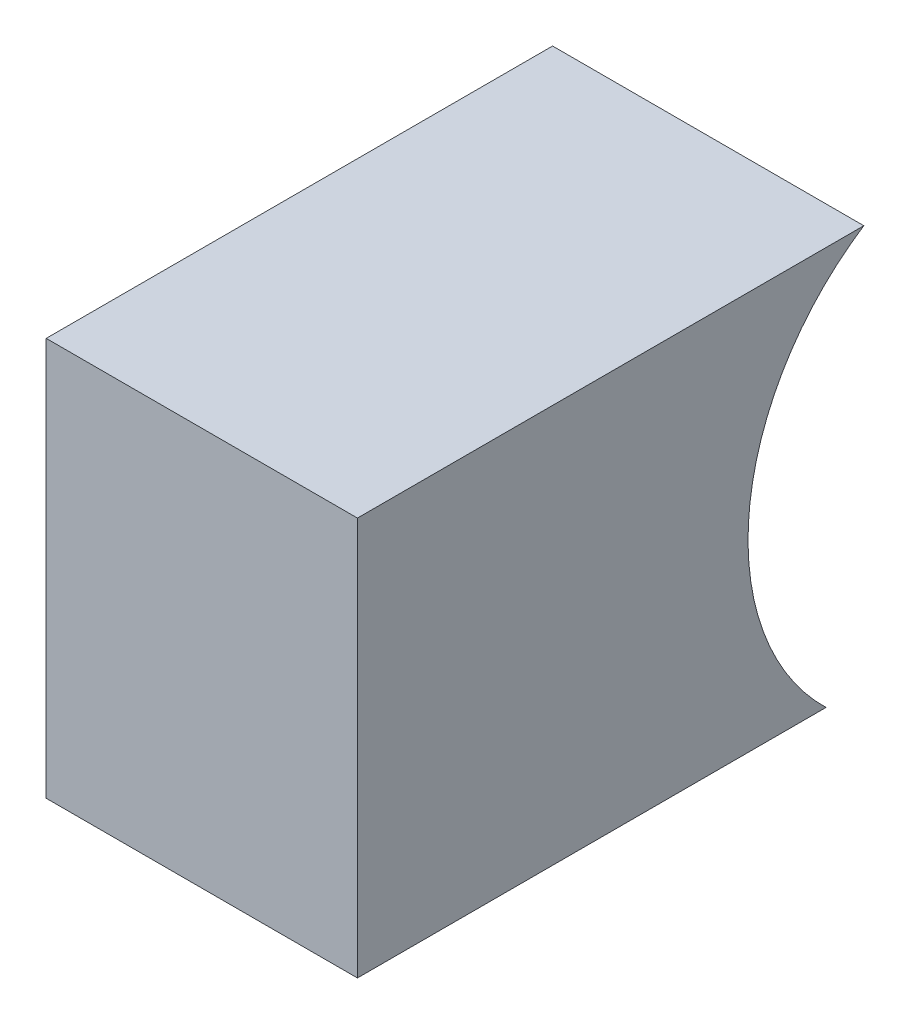
ISO-10303-21;
HEADER;
FILE_DESCRIPTION(('STEP AP214'),'2;1');
FILE_NAME('part.step','',(''),(''),'','','');
FILE_SCHEMA(('AUTOMOTIVE_DESIGN { 1 0 10303 214 1 1 1 1 }'));
ENDSEC;
DATA;
#1=APPLICATION_CONTEXT('core data for automotive mechanical design processes');
#2=APPLICATION_PROTOCOL_DEFINITION('international standard','automotive_design',2000,#1);
#3=PRODUCT_CONTEXT('',#1,'mechanical');
#4=PRODUCT('Part','Part','',(#3));
#5=PRODUCT_RELATED_PRODUCT_CATEGORY('part','',(#4));
#6=PRODUCT_DEFINITION_FORMATION('','',#4);
#7=PRODUCT_DEFINITION_CONTEXT('part definition',#1,'design');
#8=PRODUCT_DEFINITION('design','',#6,#7);
#9=PRODUCT_DEFINITION_SHAPE('','',#8);
#10=(LENGTH_UNIT() NAMED_UNIT(*) SI_UNIT(.MILLI.,.METRE.));
#11=(NAMED_UNIT(*) PLANE_ANGLE_UNIT() SI_UNIT($,.RADIAN.));
#12=(NAMED_UNIT(*) SI_UNIT($,.STERADIAN.) SOLID_ANGLE_UNIT());
#13=UNCERTAINTY_MEASURE_WITH_UNIT(LENGTH_MEASURE(1.E-05),#10,'distance_accuracy_value','');
#14=(GEOMETRIC_REPRESENTATION_CONTEXT(3) GLOBAL_UNCERTAINTY_ASSIGNED_CONTEXT((#13)) GLOBAL_UNIT_ASSIGNED_CONTEXT((#10,
#11,#12)) REPRESENTATION_CONTEXT('',''));
#15=CARTESIAN_POINT('',(0.,0.,0.));
#16=DIRECTION('',(0.,0.,1.));
#17=DIRECTION('',(1.,0.,0.));
#18=AXIS2_PLACEMENT_3D('',#15,#16,#17);
#19=CARTESIAN_POINT('',(208.5,-54.,101.5));
#20=DIRECTION('',(1.,0.,0.));
#21=DIRECTION('',(0.,0.,-1.));
#22=AXIS2_PLACEMENT_3D('',#19,#20,#21);
#23=PLANE('',#22);
#24=DIRECTION('',(0.,0.,-1.));
#25=VECTOR('',#24,1.);
#26=CARTESIAN_POINT('',(208.5,21.41373526291,101.5));
#27=LINE('',#26,#25);
#28=CARTESIAN_POINT('',(208.5,21.413735262745,-51.3581655865));
#29=VERTEX_POINT('',#28);
#30=CARTESIAN_POINT('',(208.5,21.413735262745,-57.3057153610055));
#31=VERTEX_POINT('',#30);
#32=EDGE_CURVE('E84',#29,#31,#27,.T.);
#33=ORIENTED_EDGE('',*,*,#32,.T.);
#34=CARTESIAN_POINT('',(208.5,23.7500000000041,-59.5649999999966));
#35=DIRECTION('',(1.,0.,0.));
#36=DIRECTION('',(0.,0.475447083109707,0.879744321472137));
#37=AXIS2_PLACEMENT_3D('',#34,#35,#36);
#38=ELLIPSE('',#37,3.25000000537081,3.25);
#39=CARTESIAN_POINT('',(208.5,26.4687673546375,-57.784324812793));
#40=VERTEX_POINT('',#39);
#41=EDGE_CURVE('E20',#31,#40,#38,.F.);
#42=ORIENTED_EDGE('',*,*,#41,.T.);
#43=DIRECTION('',(0.,0.,-1.));
#44=VECTOR('',#43,1.);
#45=CARTESIAN_POINT('',(208.5,26.46876735024,101.5));
#46=LINE('',#45,#44);
#47=CARTESIAN_POINT('',(208.5,26.46876735696,-51.3581655865));
#48=VERTEX_POINT('',#47);
#49=EDGE_CURVE('E67',#40,#48,#46,.F.);
#50=ORIENTED_EDGE('',*,*,#49,.T.);
#51=DIRECTION('',(0.,1.,0.));
#52=VECTOR('',#51,1.);
#53=CARTESIAN_POINT('',(208.5,23.94125122383,-51.3581655865));
#54=LINE('',#53,#52);
#55=EDGE_CURVE('E151',#29,#48,#54,.T.);
#56=ORIENTED_EDGE('',*,*,#55,.F.);
#57=EDGE_LOOP('',(#33,#42,#50,#56));
#58=FACE_BOUND('',#57,.T.);
#59=ADVANCED_FACE('F17',(#58),#23,.T.);
#60=CARTESIAN_POINT('',(206.525,23.74994601633,-59.56509988878));
#61=DIRECTION('',(0.999999998347444,2.73335058164612E-05,5.05765991257722E-05));
#62=DIRECTION('',(5.05765991446656E-05,0.,-0.999999998721004));
#63=AXIS2_PLACEMENT_3D('',#60,#61,#62);
#64=CYLINDRICAL_SURFACE('',#63,3.25);
#65=ORIENTED_EDGE('',*,*,#41,.F.);
#66=CARTESIAN_POINT('',(208.50005329645,21.4137352626022,-57.305715359996));
#67=CARTESIAN_POINT('',(207.841719962586,21.4137352625985,-57.3057300494627));
#68=CARTESIAN_POINT('',(207.183386628721,21.4137352625948,-57.3057447389294));
#69=CARTESIAN_POINT('',(205.866719960992,21.4137352625874,-57.3057741178629));
#70=CARTESIAN_POINT('',(205.208386627127,21.4137352625837,-57.3057888073296));
#71=CARTESIAN_POINT('',(204.550053293262,21.41373526258,-57.3058034967964));
#72=B_SPLINE_CURVE_WITH_KNOTS('',3,(#66,#67,#68,#69,#70,#71),.UNSPECIFIED.,.F.,.F.,(4,2,4),(0.,
1.9750000020856,3.95000000417118),.UNSPECIFIED.);
#73=CARTESIAN_POINT('',(204.550053293989,21.4137146391953,-57.3058360637797));
#74=VERTEX_POINT('',#73);
#75=EDGE_CURVE('E75',#31,#74,#72,.T.);
#76=ORIENTED_EDGE('',*,*,#75,.T.);
#77=CARTESIAN_POINT('',(204.55,23.7498920326559,-59.5651997775634));
#78=DIRECTION('',(1.,0.,0.));
#79=DIRECTION('',(0.,0.475447083109707,0.879744321472137));
#80=AXIS2_PLACEMENT_3D('',#77,#78,#79);
#81=ELLIPSE('',#80,3.25000000537081,3.25);
#82=CARTESIAN_POINT('',(204.55,26.468767368035,-57.7846894752705));
#83=VERTEX_POINT('',#82);
#84=EDGE_CURVE('E58',#74,#83,#81,.F.);
#85=ORIENTED_EDGE('',*,*,#84,.T.);
#86=DIRECTION('',(0.999999995738544,0.,9.23196149476594E-05));
#87=VECTOR('',#86,1.);
#88=CARTESIAN_POINT('',(204.5499926341,26.46876736783,-57.78468947595));
#89=LINE('',#88,#87);
#90=EDGE_CURVE('E63',#83,#40,#89,.T.);
#91=ORIENTED_EDGE('',*,*,#90,.T.);
#92=EDGE_LOOP('',(#65,#76,#85,#91));
#93=FACE_BOUND('',#92,.T.);
#94=ADVANCED_FACE('F74',(#93),#64,.F.);
#95=CARTESIAN_POINT('',(206.525,26.46876736783,-54.57124513542));
#96=DIRECTION('',(0.,-1.,0.));
#97=DIRECTION('',(0.,0.,-1.));
#98=AXIS2_PLACEMENT_3D('',#95,#96,#97);
#99=PLANE('',#98);
#100=DIRECTION('',(0.,0.,-1.));
#101=VECTOR('',#100,1.);
#102=CARTESIAN_POINT('',(204.55,26.46876736824,101.5));
#103=LINE('',#102,#101);
#104=CARTESIAN_POINT('',(204.55,26.46876736672,-51.3581655865));
#105=VERTEX_POINT('',#104);
#106=EDGE_CURVE('E66',#83,#105,#103,.F.);
#107=ORIENTED_EDGE('',*,*,#106,.T.);
#108=DIRECTION('',(1.,0.,0.));
#109=VECTOR('',#108,1.);
#110=CARTESIAN_POINT('',(206.525,26.46876736368,-51.3581655865));
#111=LINE('',#110,#109);
#112=EDGE_CURVE('E68',#48,#105,#111,.F.);
#113=ORIENTED_EDGE('',*,*,#112,.F.);
#114=ORIENTED_EDGE('',*,*,#49,.F.);
#115=ORIENTED_EDGE('',*,*,#90,.F.);
#116=EDGE_LOOP('',(#107,#113,#114,#115));
#117=FACE_BOUND('',#116,.T.);
#118=ADVANCED_FACE('F64',(#117),#99,.F.);
#119=CARTESIAN_POINT('',(206.525,23.94125122383,-51.3581655865));
#120=DIRECTION('',(0.,0.,1.));
#121=DIRECTION('',(1.,0.,0.));
#122=AXIS2_PLACEMENT_3D('',#119,#120,#121);
#123=PLANE('',#122);
#124=DIRECTION('',(1.,0.,0.));
#125=VECTOR('',#124,1.);
#126=CARTESIAN_POINT('',(206.525,21.41373526258,-51.3581655865));
#127=LINE('',#126,#125);
#128=CARTESIAN_POINT('',(204.55,21.41373526258,-51.3581655865));
#129=VERTEX_POINT('',#128);
#130=EDGE_CURVE('E34',#129,#29,#127,.T.);
#131=ORIENTED_EDGE('',*,*,#130,.T.);
#132=ORIENTED_EDGE('',*,*,#55,.T.);
#133=ORIENTED_EDGE('',*,*,#112,.T.);
#134=DIRECTION('',(0.,1.,0.));
#135=VECTOR('',#134,1.);
#136=CARTESIAN_POINT('',(204.55,-54.,-51.3581655865));
#137=LINE('',#136,#135);
#138=EDGE_CURVE('E26',#105,#129,#137,.F.);
#139=ORIENTED_EDGE('',*,*,#138,.T.);
#140=EDGE_LOOP('',(#131,#132,#133,#139));
#141=FACE_BOUND('',#140,.T.);
#142=ADVANCED_FACE('F100',(#141),#123,.T.);
#143=CARTESIAN_POINT('',(206.525,21.41373526258,-54.33194047412));
#144=DIRECTION('',(0.,1.,0.));
#145=DIRECTION('',(0.,0.,1.));
#146=AXIS2_PLACEMENT_3D('',#143,#144,#145);
#147=PLANE('',#146);
#148=DIRECTION('',(0.,0.,1.));
#149=VECTOR('',#148,1.);
#150=CARTESIAN_POINT('',(204.55,21.41373526258,-54.33194047412));
#151=LINE('',#150,#149);
#152=EDGE_CURVE('E11',#129,#74,#151,.F.);
#153=ORIENTED_EDGE('',*,*,#152,.T.);
#154=ORIENTED_EDGE('',*,*,#75,.F.);
#155=ORIENTED_EDGE('',*,*,#32,.F.);
#156=ORIENTED_EDGE('',*,*,#130,.F.);
#157=EDGE_LOOP('',(#153,#154,#155,#156));
#158=FACE_BOUND('',#157,.T.);
#159=ADVANCED_FACE('F95',(#158),#147,.F.);
#160=CARTESIAN_POINT('',(204.55,-54.,101.5));
#161=DIRECTION('',(1.,0.,0.));
#162=DIRECTION('',(0.,0.,-1.));
#163=AXIS2_PLACEMENT_3D('',#160,#161,#162);
#164=PLANE('',#163);
#165=ORIENTED_EDGE('',*,*,#138,.F.);
#166=ORIENTED_EDGE('',*,*,#106,.F.);
#167=ORIENTED_EDGE('',*,*,#84,.F.);
#168=ORIENTED_EDGE('',*,*,#152,.F.);
#169=EDGE_LOOP('',(#165,#166,#167,#168));
#170=FACE_BOUND('',#169,.T.);
#171=ADVANCED_FACE('F71',(#170),#164,.F.);
#172=CLOSED_SHELL('',(#59,#94,#118,#142,#159,#171));
#173=MANIFOLD_SOLID_BREP('B1',#172);
#174=ADVANCED_BREP_SHAPE_REPRESENTATION('',(#18,#173),#14);
#175=SHAPE_DEFINITION_REPRESENTATION(#9,#174);
ENDSEC;
END-ISO-10303-21;
